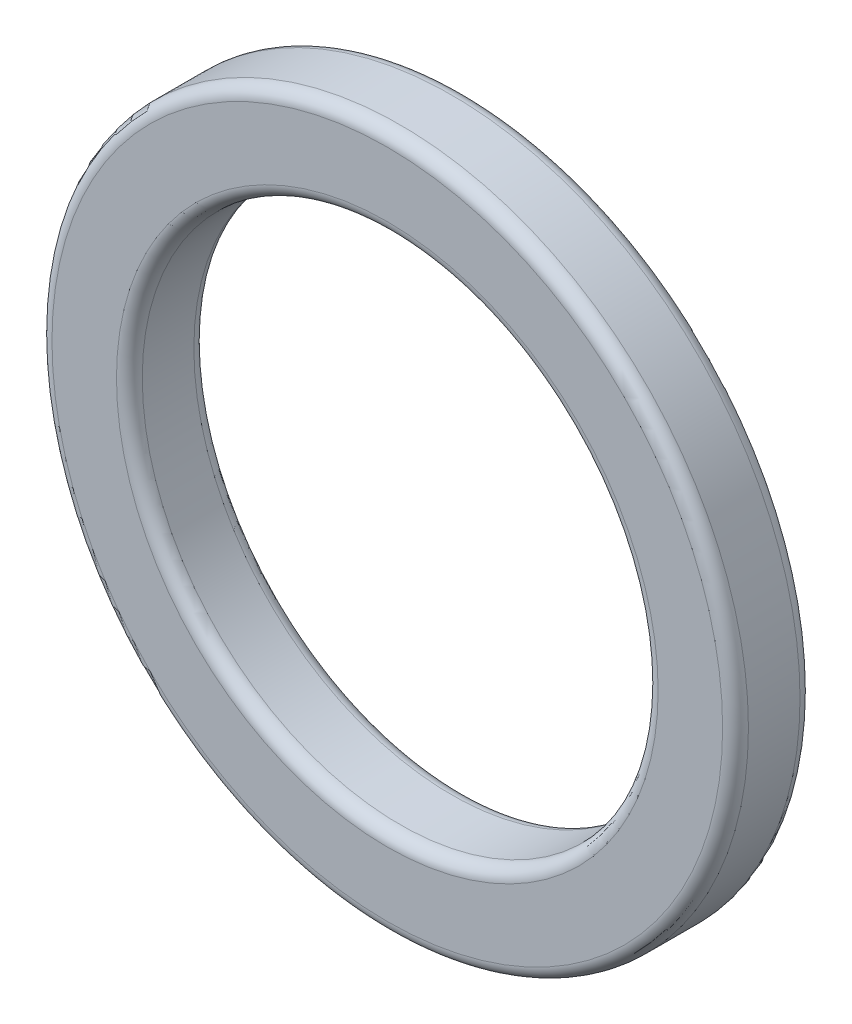
ISO-10303-21;
HEADER;
FILE_DESCRIPTION(('STEP AP214'),'2;1');
FILE_NAME('part.step','',(''),(''),'','','');
FILE_SCHEMA(('AUTOMOTIVE_DESIGN { 1 0 10303 214 1 1 1 1 }'));
ENDSEC;
DATA;
#1=APPLICATION_CONTEXT('core data for automotive mechanical design processes');
#2=APPLICATION_PROTOCOL_DEFINITION('international standard','automotive_design',2000,#1);
#3=PRODUCT_CONTEXT('',#1,'mechanical');
#4=PRODUCT('Part','Part','',(#3));
#5=PRODUCT_RELATED_PRODUCT_CATEGORY('part','',(#4));
#6=PRODUCT_DEFINITION_FORMATION('','',#4);
#7=PRODUCT_DEFINITION_CONTEXT('part definition',#1,'design');
#8=PRODUCT_DEFINITION('design','',#6,#7);
#9=PRODUCT_DEFINITION_SHAPE('','',#8);
#10=(LENGTH_UNIT() NAMED_UNIT(*) SI_UNIT(.MILLI.,.METRE.));
#11=(NAMED_UNIT(*) PLANE_ANGLE_UNIT() SI_UNIT($,.RADIAN.));
#12=(NAMED_UNIT(*) SI_UNIT($,.STERADIAN.) SOLID_ANGLE_UNIT());
#13=UNCERTAINTY_MEASURE_WITH_UNIT(LENGTH_MEASURE(1.E-05),#10,'distance_accuracy_value','');
#14=(GEOMETRIC_REPRESENTATION_CONTEXT(3) GLOBAL_UNCERTAINTY_ASSIGNED_CONTEXT((#13)) GLOBAL_UNIT_ASSIGNED_CONTEXT((#10,
#11,#12)) REPRESENTATION_CONTEXT('',''));
#15=CARTESIAN_POINT('',(0.,0.,0.));
#16=DIRECTION('',(0.,0.,1.));
#17=DIRECTION('',(1.,0.,0.));
#18=AXIS2_PLACEMENT_3D('',#15,#16,#17);
#19=CARTESIAN_POINT('',(0.,0.,0.15));
#20=DIRECTION('',(0.,0.,1.));
#21=DIRECTION('',(1.,0.,0.));
#22=AXIS2_PLACEMENT_3D('',#19,#20,#21);
#23=PLANE('',#22);
#24=CARTESIAN_POINT('',(0.,0.,0.15));
#25=DIRECTION('',(0.,0.,1.));
#26=DIRECTION('',(1.,0.,0.));
#27=AXIS2_PLACEMENT_3D('',#24,#25,#26);
#28=CIRCLE('',#27,0.525);
#29=CARTESIAN_POINT('',(0.525,0.,0.15));
#30=VERTEX_POINT('',#29);
#31=EDGE_CURVE('E10',#30,#30,#28,.F.);
#32=ORIENTED_EDGE('',*,*,#31,.T.);
#33=EDGE_LOOP('',(#32));
#34=FACE_BOUND('',#33,.T.);
#35=CARTESIAN_POINT('',(0.,0.,0.15));
#36=DIRECTION('',(0.,0.,1.));
#37=DIRECTION('',(1.,0.,0.));
#38=AXIS2_PLACEMENT_3D('',#35,#36,#37);
#39=CIRCLE('',#38,0.65);
#40=CARTESIAN_POINT('',(0.65,0.,0.15));
#41=VERTEX_POINT('',#40);
#42=EDGE_CURVE('E38',#41,#41,#39,.T.);
#43=ORIENTED_EDGE('',*,*,#42,.T.);
#44=EDGE_LOOP('',(#43));
#45=FACE_BOUND('',#44,.T.);
#46=ADVANCED_FACE('F31',(#34,#45),#23,.T.);
#47=CARTESIAN_POINT('',(0.,0.,0.));
#48=DIRECTION('',(0.,0.,1.));
#49=DIRECTION('',(1.,0.,0.));
#50=AXIS2_PLACEMENT_3D('',#47,#48,#49);
#51=PLANE('',#50);
#52=CARTESIAN_POINT('',(0.,0.,0.));
#53=DIRECTION('',(0.,0.,1.));
#54=DIRECTION('',(1.,0.,0.));
#55=AXIS2_PLACEMENT_3D('',#52,#53,#54);
#56=CIRCLE('',#55,0.525);
#57=CARTESIAN_POINT('',(0.525,0.,0.));
#58=VERTEX_POINT('',#57);
#59=EDGE_CURVE('E57',#58,#58,#56,.T.);
#60=ORIENTED_EDGE('',*,*,#59,.T.);
#61=EDGE_LOOP('',(#60));
#62=FACE_BOUND('',#61,.T.);
#63=CARTESIAN_POINT('',(0.,0.,0.));
#64=DIRECTION('',(0.,0.,1.));
#65=DIRECTION('',(1.,0.,0.));
#66=AXIS2_PLACEMENT_3D('',#63,#64,#65);
#67=CIRCLE('',#66,0.65);
#68=CARTESIAN_POINT('',(0.65,0.,0.));
#69=VERTEX_POINT('',#68);
#70=EDGE_CURVE('E60',#69,#69,#67,.F.);
#71=ORIENTED_EDGE('',*,*,#70,.T.);
#72=EDGE_LOOP('',(#71));
#73=FACE_BOUND('',#72,.T.);
#74=ADVANCED_FACE('F64',(#62,#73),#51,.F.);
#75=CARTESIAN_POINT('',(0.,0.,0.15));
#76=DIRECTION('',(0.,0.,-1.));
#77=DIRECTION('',(-1.,0.,0.));
#78=AXIS2_PLACEMENT_3D('',#75,#76,#77);
#79=CYLINDRICAL_SURFACE('',#78,0.675);
#80=CARTESIAN_POINT('',(0.,0.,0.025));
#81=DIRECTION('',(0.,0.,1.));
#82=DIRECTION('',(1.,0.,0.));
#83=AXIS2_PLACEMENT_3D('',#80,#81,#82);
#84=CIRCLE('',#83,0.675);
#85=CARTESIAN_POINT('',(0.675,0.,0.025));
#86=VERTEX_POINT('',#85);
#87=EDGE_CURVE('E42',#86,#86,#84,.T.);
#88=ORIENTED_EDGE('',*,*,#87,.T.);
#89=EDGE_LOOP('',(#88));
#90=FACE_BOUND('',#89,.T.);
#91=CARTESIAN_POINT('',(0.,0.,0.125));
#92=DIRECTION('',(0.,0.,1.));
#93=DIRECTION('',(1.,0.,0.));
#94=AXIS2_PLACEMENT_3D('',#91,#92,#93);
#95=CIRCLE('',#94,0.675);
#96=CARTESIAN_POINT('',(0.675,0.,0.125));
#97=VERTEX_POINT('',#96);
#98=EDGE_CURVE('E46',#97,#97,#95,.F.);
#99=ORIENTED_EDGE('',*,*,#98,.T.);
#100=EDGE_LOOP('',(#99));
#101=FACE_BOUND('',#100,.T.);
#102=ADVANCED_FACE('F74',(#90,#101),#79,.T.);
#103=CARTESIAN_POINT('',(0.,0.,0.15));
#104=DIRECTION('',(0.,0.,-1.));
#105=DIRECTION('',(-1.,0.,0.));
#106=AXIS2_PLACEMENT_3D('',#103,#104,#105);
#107=CYLINDRICAL_SURFACE('',#106,0.5);
#108=CARTESIAN_POINT('',(0.,0.,0.025));
#109=DIRECTION('',(0.,0.,1.));
#110=DIRECTION('',(1.,0.,0.));
#111=AXIS2_PLACEMENT_3D('',#108,#109,#110);
#112=CIRCLE('',#111,0.5);
#113=CARTESIAN_POINT('',(0.5,0.,0.025));
#114=VERTEX_POINT('',#113);
#115=EDGE_CURVE('E51',#114,#114,#112,.F.);
#116=ORIENTED_EDGE('',*,*,#115,.T.);
#117=EDGE_LOOP('',(#116));
#118=FACE_BOUND('',#117,.T.);
#119=CARTESIAN_POINT('',(0.,0.,0.125));
#120=DIRECTION('',(0.,0.,1.));
#121=DIRECTION('',(1.,0.,0.));
#122=AXIS2_PLACEMENT_3D('',#119,#120,#121);
#123=CIRCLE('',#122,0.5);
#124=CARTESIAN_POINT('',(0.5,0.,0.125));
#125=VERTEX_POINT('',#124);
#126=EDGE_CURVE('E54',#125,#125,#123,.T.);
#127=ORIENTED_EDGE('',*,*,#126,.T.);
#128=EDGE_LOOP('',(#127));
#129=FACE_BOUND('',#128,.T.);
#130=ADVANCED_FACE('F77',(#118,#129),#107,.F.);
#131=CARTESIAN_POINT('',(0.,0.,0.025));
#132=DIRECTION('',(0.,0.,1.));
#133=DIRECTION('',(1.,0.,0.));
#134=AXIS2_PLACEMENT_3D('',#131,#132,#133);
#135=TOROIDAL_SURFACE('',#134,0.525,0.025);
#136=ORIENTED_EDGE('',*,*,#115,.F.);
#137=EDGE_LOOP('',(#136));
#138=FACE_BOUND('',#137,.T.);
#139=ORIENTED_EDGE('',*,*,#59,.F.);
#140=EDGE_LOOP('',(#139));
#141=FACE_BOUND('',#140,.T.);
#142=ADVANCED_FACE('F70',(#138,#141),#135,.T.);
#143=CARTESIAN_POINT('',(0.,0.,0.025));
#144=DIRECTION('',(0.,0.,1.));
#145=DIRECTION('',(1.,0.,0.));
#146=AXIS2_PLACEMENT_3D('',#143,#144,#145);
#147=TOROIDAL_SURFACE('',#146,0.65,0.025);
#148=ORIENTED_EDGE('',*,*,#70,.F.);
#149=EDGE_LOOP('',(#148));
#150=FACE_BOUND('',#149,.T.);
#151=ORIENTED_EDGE('',*,*,#87,.F.);
#152=EDGE_LOOP('',(#151));
#153=FACE_BOUND('',#152,.T.);
#154=ADVANCED_FACE('F66',(#150,#153),#147,.T.);
#155=CARTESIAN_POINT('',(0.,0.,0.125));
#156=DIRECTION('',(0.,0.,1.));
#157=DIRECTION('',(1.,0.,0.));
#158=AXIS2_PLACEMENT_3D('',#155,#156,#157);
#159=TOROIDAL_SURFACE('',#158,0.525,0.025);
#160=ORIENTED_EDGE('',*,*,#31,.F.);
#161=EDGE_LOOP('',(#160));
#162=FACE_BOUND('',#161,.T.);
#163=ORIENTED_EDGE('',*,*,#126,.F.);
#164=EDGE_LOOP('',(#163));
#165=FACE_BOUND('',#164,.T.);
#166=ADVANCED_FACE('F69',(#162,#165),#159,.T.);
#167=CARTESIAN_POINT('',(0.,0.,0.125));
#168=DIRECTION('',(0.,0.,1.));
#169=DIRECTION('',(1.,0.,0.));
#170=AXIS2_PLACEMENT_3D('',#167,#168,#169);
#171=TOROIDAL_SURFACE('',#170,0.65,0.025);
#172=ORIENTED_EDGE('',*,*,#98,.F.);
#173=EDGE_LOOP('',(#172));
#174=FACE_BOUND('',#173,.T.);
#175=ORIENTED_EDGE('',*,*,#42,.F.);
#176=EDGE_LOOP('',(#175));
#177=FACE_BOUND('',#176,.T.);
#178=ADVANCED_FACE('F33',(#174,#177),#171,.T.);
#179=CLOSED_SHELL('',(#46,#74,#102,#130,#142,#154,#166,#178));
#180=MANIFOLD_SOLID_BREP('B2',#179);
#181=ADVANCED_BREP_SHAPE_REPRESENTATION('',(#18,#180),#14);
#182=SHAPE_DEFINITION_REPRESENTATION(#9,#181);
ENDSEC;
END-ISO-10303-21;
